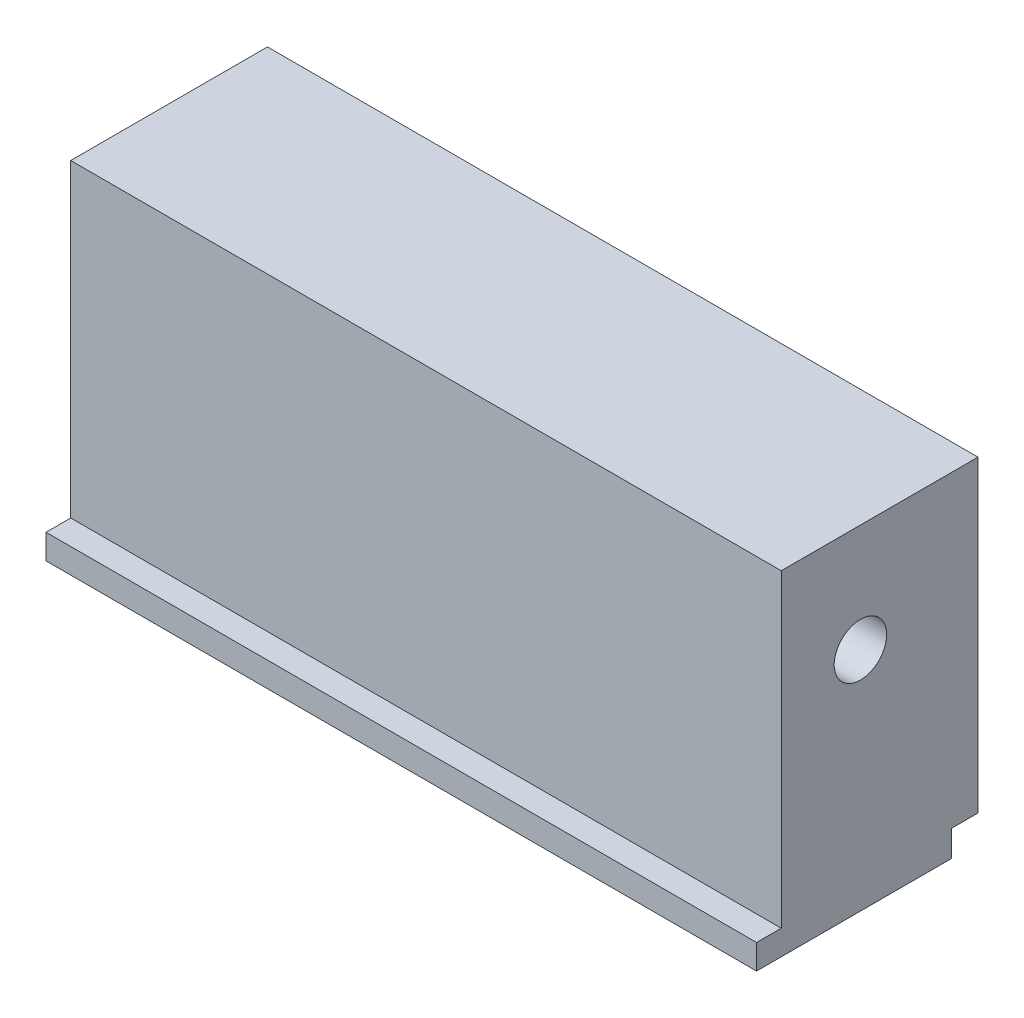
ISO-10303-21;
HEADER;
FILE_DESCRIPTION(('STEP AP214'),'2;1');
FILE_NAME('part.step','',(''),(''),'','','');
FILE_SCHEMA(('AUTOMOTIVE_DESIGN { 1 0 10303 214 1 1 1 1 }'));
ENDSEC;
DATA;
#1=APPLICATION_CONTEXT('core data for automotive mechanical design processes');
#2=APPLICATION_PROTOCOL_DEFINITION('international standard','automotive_design',2000,#1);
#3=PRODUCT_CONTEXT('',#1,'mechanical');
#4=PRODUCT('Part','Part','',(#3));
#5=PRODUCT_RELATED_PRODUCT_CATEGORY('part','',(#4));
#6=PRODUCT_DEFINITION_FORMATION('','',#4);
#7=PRODUCT_DEFINITION_CONTEXT('part definition',#1,'design');
#8=PRODUCT_DEFINITION('design','',#6,#7);
#9=PRODUCT_DEFINITION_SHAPE('','',#8);
#10=(LENGTH_UNIT() NAMED_UNIT(*) SI_UNIT(.MILLI.,.METRE.));
#11=(NAMED_UNIT(*) PLANE_ANGLE_UNIT() SI_UNIT($,.RADIAN.));
#12=(NAMED_UNIT(*) SI_UNIT($,.STERADIAN.) SOLID_ANGLE_UNIT());
#13=UNCERTAINTY_MEASURE_WITH_UNIT(LENGTH_MEASURE(1.E-05),#10,'distance_accuracy_value','');
#14=(GEOMETRIC_REPRESENTATION_CONTEXT(3) GLOBAL_UNCERTAINTY_ASSIGNED_CONTEXT((#13)) GLOBAL_UNIT_ASSIGNED_CONTEXT((#10,
#11,#12)) REPRESENTATION_CONTEXT('',''));
#15=CARTESIAN_POINT('',(0.,0.,0.));
#16=DIRECTION('',(0.,0.,1.));
#17=DIRECTION('',(1.,0.,0.));
#18=AXIS2_PLACEMENT_3D('',#15,#16,#17);
#19=CARTESIAN_POINT('',(-16.1377397473881,22.8793956546598,24.13));
#20=DIRECTION('',(1.,0.,0.));
#21=DIRECTION('',(0.,1.,0.));
#22=AXIS2_PLACEMENT_3D('',#19,#20,#21);
#23=PLANE('',#22);
#24=CARTESIAN_POINT('',(-16.1377397473881,12.3793956546598,11.43));
#25=DIRECTION('',(-1.,0.,0.));
#26=DIRECTION('',(0.,0.,1.));
#27=AXIS2_PLACEMENT_3D('',#24,#25,#26);
#28=CIRCLE('',#27,2.5527);
#29=CARTESIAN_POINT('',(-16.1377397473881,12.3793956546598,13.9827));
#30=VERTEX_POINT('',#29);
#31=EDGE_CURVE('E192',#30,#30,#28,.T.);
#32=ORIENTED_EDGE('',*,*,#31,.F.);
#33=EDGE_LOOP('',(#32));
#34=FACE_BOUND('',#33,.T.);
#35=DIRECTION('',(0.,0.,1.));
#36=VECTOR('',#35,1.);
#37=CARTESIAN_POINT('',(-16.1377397473881,-7.22381931804489,19.13));
#38=LINE('',#37,#36);
#39=CARTESIAN_POINT('',(-16.1377397473881,-7.22381931804489,19.13));
#40=VERTEX_POINT('',#39);
#41=CARTESIAN_POINT('',(-16.1377397473881,-7.22381931804489,21.53285));
#42=VERTEX_POINT('',#41);
#43=EDGE_CURVE('E68',#40,#42,#38,.T.);
#44=ORIENTED_EDGE('',*,*,#43,.F.);
#45=DIRECTION('',(0.,-1.,0.));
#46=VECTOR('',#45,1.);
#47=CARTESIAN_POINT('',(-16.1377397473881,24.0442483824095,19.13));
#48=LINE('',#47,#46);
#49=CARTESIAN_POINT('',(-16.1377397473881,22.8793956546598,19.13));
#50=VERTEX_POINT('',#49);
#51=EDGE_CURVE('E140',#50,#40,#48,.T.);
#52=ORIENTED_EDGE('',*,*,#51,.F.);
#53=DIRECTION('',(0.,0.,-1.));
#54=VECTOR('',#53,1.);
#55=CARTESIAN_POINT('',(-16.1377397473881,22.8793956546598,24.13));
#56=LINE('',#55,#54);
#57=CARTESIAN_POINT('',(-16.1377397473881,22.8793956546598,0.));
#58=VERTEX_POINT('',#57);
#59=EDGE_CURVE('E76',#50,#58,#56,.T.);
#60=ORIENTED_EDGE('',*,*,#59,.T.);
#61=DIRECTION('',(0.,-1.,0.));
#62=VECTOR('',#61,1.);
#63=CARTESIAN_POINT('',(-16.1377397473881,22.8793956546598,0.));
#64=LINE('',#63,#62);
#65=CARTESIAN_POINT('',(-16.1377397473881,-7.08960434534017,0.));
#66=VERTEX_POINT('',#65);
#67=EDGE_CURVE('E212',#58,#66,#64,.T.);
#68=ORIENTED_EDGE('',*,*,#67,.T.);
#69=DIRECTION('',(0.,0.,-1.));
#70=VECTOR('',#69,1.);
#71=CARTESIAN_POINT('',(-16.1377397473881,-7.08960434534017,24.13));
#72=LINE('',#71,#70);
#73=CARTESIAN_POINT('',(-16.1377397473881,-7.08960434534017,2.59715));
#74=VERTEX_POINT('',#73);
#75=EDGE_CURVE('E185',#74,#66,#72,.T.);
#76=ORIENTED_EDGE('',*,*,#75,.F.);
#77=DIRECTION('',(0.,-1.,0.));
#78=VECTOR('',#77,1.);
#79=CARTESIAN_POINT('',(-16.1377397473881,22.8793956546598,2.59714999999999));
#80=LINE('',#79,#78);
#81=CARTESIAN_POINT('',(-16.1377397473881,-9.63260434534019,2.59715));
#82=VERTEX_POINT('',#81);
#83=EDGE_CURVE('E208',#74,#82,#80,.T.);
#84=ORIENTED_EDGE('',*,*,#83,.T.);
#85=DIRECTION('',(0.,0.,-1.));
#86=VECTOR('',#85,1.);
#87=CARTESIAN_POINT('',(-16.1377397473881,-9.63260434534019,24.13));
#88=LINE('',#87,#86);
#89=CARTESIAN_POINT('',(-16.1377397473881,-9.63260434534019,21.53285));
#90=VERTEX_POINT('',#89);
#91=EDGE_CURVE('E231',#90,#82,#88,.T.);
#92=ORIENTED_EDGE('',*,*,#91,.F.);
#93=DIRECTION('',(0.,1.,0.));
#94=VECTOR('',#93,1.);
#95=CARTESIAN_POINT('',(-16.1377397473881,22.8793956546598,21.53285));
#96=LINE('',#95,#94);
#97=EDGE_CURVE('E200',#90,#42,#96,.T.);
#98=ORIENTED_EDGE('',*,*,#97,.T.);
#99=EDGE_LOOP('',(#44,#52,#60,#68,#76,#84,#92,#98));
#100=FACE_BOUND('',#99,.T.);
#101=ADVANCED_FACE('F47',(#34,#100),#23,.F.);
#102=CARTESIAN_POINT('',(52.9502602526119,22.8793956546598,24.13));
#103=DIRECTION('',(-1.,0.,0.));
#104=DIRECTION('',(0.,0.,1.));
#105=AXIS2_PLACEMENT_3D('',#102,#103,#104);
#106=PLANE('',#105);
#107=CARTESIAN_POINT('',(52.9502602526119,12.3793956546598,11.43));
#108=DIRECTION('',(1.,0.,0.));
#109=DIRECTION('',(0.,0.,-1.));
#110=AXIS2_PLACEMENT_3D('',#107,#108,#109);
#111=CIRCLE('',#110,2.5527);
#112=CARTESIAN_POINT('',(52.9502602526119,12.3793956546598,8.8773));
#113=VERTEX_POINT('',#112);
#114=EDGE_CURVE('E134',#113,#113,#111,.T.);
#115=ORIENTED_EDGE('',*,*,#114,.F.);
#116=EDGE_LOOP('',(#115));
#117=FACE_BOUND('',#116,.T.);
#118=DIRECTION('',(0.,0.,-1.));
#119=VECTOR('',#118,1.);
#120=CARTESIAN_POINT('',(52.9502602526119,22.8793956546598,24.13));
#121=LINE('',#120,#119);
#122=CARTESIAN_POINT('',(52.9502602526119,22.8793956546598,19.13));
#123=VERTEX_POINT('',#122);
#124=CARTESIAN_POINT('',(52.9502602526119,22.8793956546598,0.));
#125=VERTEX_POINT('',#124);
#126=EDGE_CURVE('E224',#123,#125,#121,.T.);
#127=ORIENTED_EDGE('',*,*,#126,.F.);
#128=DIRECTION('',(0.,-1.,0.));
#129=VECTOR('',#128,1.);
#130=CARTESIAN_POINT('',(52.9502602526119,22.8793956546598,19.13));
#131=LINE('',#130,#129);
#132=CARTESIAN_POINT('',(52.9502602526119,-7.22381931804489,19.13));
#133=VERTEX_POINT('',#132);
#134=EDGE_CURVE('E156',#123,#133,#131,.T.);
#135=ORIENTED_EDGE('',*,*,#134,.T.);
#136=DIRECTION('',(0.,0.,1.));
#137=VECTOR('',#136,1.);
#138=CARTESIAN_POINT('',(52.9502602526119,-7.22381931804489,24.13));
#139=LINE('',#138,#137);
#140=CARTESIAN_POINT('',(52.9502602526119,-7.22381931804489,21.53285));
#141=VERTEX_POINT('',#140);
#142=EDGE_CURVE('E152',#133,#141,#139,.T.);
#143=ORIENTED_EDGE('',*,*,#142,.T.);
#144=DIRECTION('',(0.,-1.,0.));
#145=VECTOR('',#144,1.);
#146=CARTESIAN_POINT('',(52.9502602526119,22.8793956546598,21.53285));
#147=LINE('',#146,#145);
#148=CARTESIAN_POINT('',(52.9502602526119,-9.63260434534019,21.53285));
#149=VERTEX_POINT('',#148);
#150=EDGE_CURVE('E235',#141,#149,#147,.T.);
#151=ORIENTED_EDGE('',*,*,#150,.T.);
#152=DIRECTION('',(0.,0.,-1.));
#153=VECTOR('',#152,1.);
#154=CARTESIAN_POINT('',(52.9502602526119,-9.63260434534019,24.13));
#155=LINE('',#154,#153);
#156=CARTESIAN_POINT('',(52.9502602526119,-9.63260434534019,2.59715));
#157=VERTEX_POINT('',#156);
#158=EDGE_CURVE('E227',#149,#157,#155,.T.);
#159=ORIENTED_EDGE('',*,*,#158,.T.);
#160=DIRECTION('',(0.,1.,0.));
#161=VECTOR('',#160,1.);
#162=CARTESIAN_POINT('',(52.9502602526119,22.8793956546598,2.59714999999999));
#163=LINE('',#162,#161);
#164=CARTESIAN_POINT('',(52.9502602526119,-7.08960434534017,2.59715));
#165=VERTEX_POINT('',#164);
#166=EDGE_CURVE('E238',#157,#165,#163,.T.);
#167=ORIENTED_EDGE('',*,*,#166,.T.);
#168=DIRECTION('',(0.,0.,1.));
#169=VECTOR('',#168,1.);
#170=CARTESIAN_POINT('',(52.9502602526119,-7.08960434534017,24.13));
#171=LINE('',#170,#169);
#172=CARTESIAN_POINT('',(52.9502602526119,-7.08960434534017,0.));
#173=VERTEX_POINT('',#172);
#174=EDGE_CURVE('E181',#173,#165,#171,.T.);
#175=ORIENTED_EDGE('',*,*,#174,.F.);
#176=DIRECTION('',(0.,1.,0.));
#177=VECTOR('',#176,1.);
#178=CARTESIAN_POINT('',(52.9502602526119,22.8793956546598,0.));
#179=LINE('',#178,#177);
#180=EDGE_CURVE('E215',#173,#125,#179,.T.);
#181=ORIENTED_EDGE('',*,*,#180,.T.);
#182=EDGE_LOOP('',(#127,#135,#143,#151,#159,#167,#175,#181));
#183=FACE_BOUND('',#182,.T.);
#184=ADVANCED_FACE('F289',(#117,#183),#106,.F.);
#185=CARTESIAN_POINT('',(-16.1377397473881,-9.63260434534019,0.));
#186=DIRECTION('',(0.,0.,1.));
#187=DIRECTION('',(1.,0.,0.));
#188=AXIS2_PLACEMENT_3D('',#185,#186,#187);
#189=PLANE('',#188);
#190=DIRECTION('',(1.,0.,0.));
#191=VECTOR('',#190,1.);
#192=CARTESIAN_POINT('',(-16.1377397473881,-7.08960434534017,0.));
#193=LINE('',#192,#191);
#194=EDGE_CURVE('E241',#66,#173,#193,.T.);
#195=ORIENTED_EDGE('',*,*,#194,.F.);
#196=ORIENTED_EDGE('',*,*,#67,.F.);
#197=DIRECTION('',(-1.,0.,0.));
#198=VECTOR('',#197,1.);
#199=CARTESIAN_POINT('',(-16.1377397473881,22.8793956546598,0.));
#200=LINE('',#199,#198);
#201=EDGE_CURVE('E219',#125,#58,#200,.T.);
#202=ORIENTED_EDGE('',*,*,#201,.F.);
#203=ORIENTED_EDGE('',*,*,#180,.F.);
#204=EDGE_LOOP('',(#195,#196,#202,#203));
#205=FACE_BOUND('',#204,.T.);
#206=ADVANCED_FACE('F294',(#205),#189,.F.);
#207=CARTESIAN_POINT('',(-16.1377397473881,-9.63260434534019,24.13));
#208=DIRECTION('',(0.,1.,0.));
#209=DIRECTION('',(0.,0.,1.));
#210=AXIS2_PLACEMENT_3D('',#207,#208,#209);
#211=PLANE('',#210);
#212=CARTESIAN_POINT('',(-3.18373974738812,-9.63260434534019,12.065));
#213=DIRECTION('',(0.,-1.,0.));
#214=DIRECTION('',(0.,0.,-1.));
#215=AXIS2_PLACEMENT_3D('',#212,#213,#214);
#216=CIRCLE('',#215,3.4544);
#217=CARTESIAN_POINT('',(-3.18373974738812,-9.63260434534019,8.6106));
#218=VERTEX_POINT('',#217);
#219=EDGE_CURVE('E164',#218,#218,#216,.T.);
#220=ORIENTED_EDGE('',*,*,#219,.F.);
#221=EDGE_LOOP('',(#220));
#222=FACE_BOUND('',#221,.T.);
#223=CARTESIAN_POINT('',(39.9962602526119,-9.63260434534019,12.065));
#224=DIRECTION('',(0.,-1.,0.));
#225=DIRECTION('',(0.,0.,-1.));
#226=AXIS2_PLACEMENT_3D('',#223,#224,#225);
#227=CIRCLE('',#226,3.4544);
#228=CARTESIAN_POINT('',(39.9962602526119,-9.63260434534019,8.6106));
#229=VERTEX_POINT('',#228);
#230=EDGE_CURVE('E173',#229,#229,#227,.T.);
#231=ORIENTED_EDGE('',*,*,#230,.F.);
#232=EDGE_LOOP('',(#231));
#233=FACE_BOUND('',#232,.T.);
#234=ORIENTED_EDGE('',*,*,#91,.T.);
#235=DIRECTION('',(1.,0.,0.));
#236=VECTOR('',#235,1.);
#237=CARTESIAN_POINT('',(-16.1377397473881,-9.63260434534019,2.59715));
#238=LINE('',#237,#236);
#239=EDGE_CURVE('E204',#82,#157,#238,.T.);
#240=ORIENTED_EDGE('',*,*,#239,.T.);
#241=ORIENTED_EDGE('',*,*,#158,.F.);
#242=DIRECTION('',(-1.,0.,0.));
#243=VECTOR('',#242,1.);
#244=CARTESIAN_POINT('',(-16.1377397473881,-9.63260434534019,21.53285));
#245=LINE('',#244,#243);
#246=EDGE_CURVE('E196',#149,#90,#245,.T.);
#247=ORIENTED_EDGE('',*,*,#246,.T.);
#248=EDGE_LOOP('',(#234,#240,#241,#247));
#249=FACE_BOUND('',#248,.T.);
#250=ADVANCED_FACE('F304',(#222,#233,#249),#211,.F.);
#251=CARTESIAN_POINT('',(-16.1377397473881,22.8793956546598,24.13));
#252=DIRECTION('',(0.,-1.,0.));
#253=DIRECTION('',(0.,0.,-1.));
#254=AXIS2_PLACEMENT_3D('',#251,#252,#253);
#255=PLANE('',#254);
#256=ORIENTED_EDGE('',*,*,#59,.F.);
#257=DIRECTION('',(1.,0.,0.));
#258=VECTOR('',#257,1.);
#259=CARTESIAN_POINT('',(-16.1377397473881,22.8793956546598,19.13));
#260=LINE('',#259,#258);
#261=EDGE_CURVE('E11',#50,#123,#260,.T.);
#262=ORIENTED_EDGE('',*,*,#261,.T.);
#263=ORIENTED_EDGE('',*,*,#126,.T.);
#264=ORIENTED_EDGE('',*,*,#201,.T.);
#265=EDGE_LOOP('',(#256,#262,#263,#264));
#266=FACE_BOUND('',#265,.T.);
#267=ADVANCED_FACE('F312',(#266),#255,.F.);
#268=CARTESIAN_POINT('',(67.1742602526119,-7.21960434534019,2.59715));
#269=DIRECTION('',(0.,0.,1.));
#270=DIRECTION('',(0.,-1.,0.));
#271=AXIS2_PLACEMENT_3D('',#268,#269,#270);
#272=PLANE('',#271);
#273=ORIENTED_EDGE('',*,*,#83,.F.);
#274=DIRECTION('',(1.,0.,0.));
#275=VECTOR('',#274,1.);
#276=CARTESIAN_POINT('',(-41.5377397473881,-7.08960434534017,2.59715));
#277=LINE('',#276,#275);
#278=EDGE_CURVE('E177',#74,#165,#277,.T.);
#279=ORIENTED_EDGE('',*,*,#278,.T.);
#280=ORIENTED_EDGE('',*,*,#166,.F.);
#281=ORIENTED_EDGE('',*,*,#239,.F.);
#282=EDGE_LOOP('',(#273,#279,#280,#281));
#283=FACE_BOUND('',#282,.T.);
#284=ADVANCED_FACE('F321',(#283),#272,.F.);
#285=CARTESIAN_POINT('',(67.1742602526119,-10.3700800571753,21.53285));
#286=DIRECTION('',(0.,0.,-1.));
#287=DIRECTION('',(-1.,0.,0.));
#288=AXIS2_PLACEMENT_3D('',#285,#286,#287);
#289=PLANE('',#288);
#290=ORIENTED_EDGE('',*,*,#150,.F.);
#291=DIRECTION('',(-1.,0.,0.));
#292=VECTOR('',#291,1.);
#293=CARTESIAN_POINT('',(67.1742602526119,-7.22381931804489,21.53285));
#294=LINE('',#293,#292);
#295=EDGE_CURVE('E61',#141,#42,#294,.T.);
#296=ORIENTED_EDGE('',*,*,#295,.T.);
#297=ORIENTED_EDGE('',*,*,#97,.F.);
#298=ORIENTED_EDGE('',*,*,#246,.F.);
#299=EDGE_LOOP('',(#290,#296,#297,#298));
#300=FACE_BOUND('',#299,.T.);
#301=ADVANCED_FACE('F285',(#300),#289,.F.);
#302=CARTESIAN_POINT('',(-16.1377397473881,12.3793956546598,11.43));
#303=DIRECTION('',(-1.,0.,0.));
#304=DIRECTION('',(0.,0.,1.));
#305=AXIS2_PLACEMENT_3D('',#302,#303,#304);
#306=CYLINDRICAL_SURFACE('',#305,2.5527);
#307=CARTESIAN_POINT('',(-5.33379470105452,9.94888675724317,10.6496771247874));
#308=CARTESIAN_POINT('',(-5.27285452011806,9.96396065776999,10.602728765378));
#309=CARTESIAN_POINT('',(-5.20952725506987,9.97946930463055,10.5590620649738));
#310=CARTESIAN_POINT('',(-5.07920910806528,10.0106243760823,10.4775805669928));
#311=CARTESIAN_POINT('',(-5.01221538824365,10.0262708993023,10.4397703916458));
#312=CARTESIAN_POINT('',(-4.87519641125399,10.0571402634383,10.3693932790166));
#313=CARTESIAN_POINT('',(-4.80516289931581,10.0723617388828,10.3368419203703));
#314=CARTESIAN_POINT('',(-4.66279275637979,10.1018315884118,10.2767007566262));
#315=CARTESIAN_POINT('',(-4.59045557244914,10.1160797262528,10.2491121534275));
#316=CARTESIAN_POINT('',(-4.42116160546763,10.1473554517449,10.1907714426447));
#317=CARTESIAN_POINT('',(-4.32353015288059,10.1638736866961,10.1616939107369));
#318=CARTESIAN_POINT('',(-4.12580334721681,10.1935807663791,10.1111564920226));
#319=CARTESIAN_POINT('',(-4.0257073346674,10.2067687091203,10.0896986683324));
#320=CARTESIAN_POINT('',(-3.82393420332003,10.229046489226,10.054240448388));
#321=CARTESIAN_POINT('',(-3.72226018435047,10.2381435131213,10.0402269667171));
#322=CARTESIAN_POINT('',(-3.51787624987886,10.2517233920533,10.0195241884918));
#323=CARTESIAN_POINT('',(-3.41516648735735,10.256206918714,10.012833825843));
#324=CARTESIAN_POINT('',(-3.20951963584029,10.2602761050919,10.006756068174));
#325=CARTESIAN_POINT('',(-3.1065828105585,10.2598658793694,10.00736253814));
#326=CARTESIAN_POINT('',(-2.90113637701932,10.2541835444001,10.0158654428175));
#327=CARTESIAN_POINT('',(-2.79862681245944,10.2489109495506,10.0237626056475));
#328=CARTESIAN_POINT('',(-2.59461427234603,10.2338234761372,10.0468921871241));
#329=CARTESIAN_POINT('',(-2.49311315917578,10.2240013793262,10.0621362639588));
#330=CARTESIAN_POINT('',(-2.29198959877277,10.2003996063113,10.1000554252311));
#331=CARTESIAN_POINT('',(-2.19236684734483,10.1866205768905,10.1227292953122));
#332=CARTESIAN_POINT('',(-2.01239525115007,10.1584886820904,10.1712332712004));
#333=CARTESIAN_POINT('',(-1.9316461455555,10.1446305753784,10.1958736237474));
#334=CARTESIAN_POINT('',(-1.77236124931081,10.1152324229202,10.2506738258414));
#335=CARTESIAN_POINT('',(-1.69382509710422,10.0996926539591,10.2808327676459));
#336=CARTESIAN_POINT('',(-1.53968651161827,10.0675415749761,10.3469681509731));
#337=CARTESIAN_POINT('',(-1.46407744644726,10.0509329456023,10.3829303556648));
#338=CARTESIAN_POINT('',(-1.31638409596564,10.017277629694,10.4612418881081));
#339=CARTESIAN_POINT('',(-1.24429736385845,10.0002312601645,10.5035866961818));
#340=CARTESIAN_POINT('',(-1.10215525023242,9.96587287058051,10.597077551688));
#341=CARTESIAN_POINT('',(-1.03226760590411,9.94857353709475,10.648486505447));
#342=CARTESIAN_POINT('',(-0.899301193692127,9.91550758695134,10.7599896842142));
#343=CARTESIAN_POINT('',(-0.836217606457724,9.8997398862272,10.8200776902927));
#344=CARTESIAN_POINT('',(-0.731528802367575,9.87419581690476,10.9369711434088));
#345=CARTESIAN_POINT('',(-0.688148796215743,9.86385168775467,10.9920432967604));
#346=CARTESIAN_POINT('',(-0.610116656351126,9.84633534701834,11.1085463380688));
#347=CARTESIAN_POINT('',(-0.575448480176422,9.83915728655972,11.1699652398959));
#348=CARTESIAN_POINT('',(-0.524338014016374,9.8304061360778,11.2837259232016));
#349=CARTESIAN_POINT('',(-0.505540662094689,9.82792655452573,11.3349306020072));
#350=CARTESIAN_POINT('',(-0.476177103842152,9.82617848466938,11.4397039237887));
#351=CARTESIAN_POINT('',(-0.465602911417495,9.82690687628101,11.4932702196581));
#352=CARTESIAN_POINT('',(-0.453472301930097,9.83188323338288,11.6014571549296));
#353=CARTESIAN_POINT('',(-0.451947186278946,9.83614335756383,11.656080799079));
#354=CARTESIAN_POINT('',(-0.457944608347973,9.8481119677774,11.7644490495663));
#355=CARTESIAN_POINT('',(-0.465471666851652,9.85582217562258,11.8181932030827));
#356=CARTESIAN_POINT('',(-0.488199992494542,9.87387534013737,11.9211979363765));
#357=CARTESIAN_POINT('',(-0.503082178849013,9.88410062337235,11.9705518699916));
#358=CARTESIAN_POINT('',(-0.539162795557112,9.9067834768143,12.0663113864983));
#359=CARTESIAN_POINT('',(-0.560363386917727,9.91924181018218,12.1127159540554));
#360=CARTESIAN_POINT('',(-0.623940618583785,9.95486060599649,12.2325185187189));
#361=CARTESIAN_POINT('',(-0.67095093851204,9.97956815658997,12.3029909639794));
#362=CARTESIAN_POINT('',(-0.774864464079302,10.0318094659544,12.4350858808913));
#363=CARTESIAN_POINT('',(-0.831800117338286,10.0593523691325,12.4966780757606));
#364=CARTESIAN_POINT('',(-0.943244679795029,10.1115015201443,12.6029738249041));
#365=CARTESIAN_POINT('',(-0.99677839813124,10.1359073106587,12.648817698543));
#366=CARTESIAN_POINT('',(-1.10767281703469,10.185147677951,12.7353862376416));
#367=CARTESIAN_POINT('',(-1.16503627052262,10.2099825534523,12.7761071585922));
#368=CARTESIAN_POINT('',(-1.34182975889496,10.2844560376561,12.8914771824688));
#369=CARTESIAN_POINT('',(-1.4658527334829,10.3340114833964,12.9592341753682));
#370=CARTESIAN_POINT('',(-1.66364940269024,10.4073813191272,13.0514603285028));
#371=CARTESIAN_POINT('',(-1.73442864834815,10.4325923154278,13.0815443935967));
#372=CARTESIAN_POINT('',(-1.87834097249613,10.4812679195838,13.1372670326508));
#373=CARTESIAN_POINT('',(-1.95147436676438,10.5047322917424,13.1629050072555));
#374=CARTESIAN_POINT('',(-2.09977078989927,10.5491601098972,13.2097625331561));
#375=CARTESIAN_POINT('',(-2.17493106764195,10.5701267553531,13.230987763512));
#376=CARTESIAN_POINT('',(-2.32720350097651,10.6087686848207,13.2689922814415));
#377=CARTESIAN_POINT('',(-2.40431540956554,10.6264443829994,13.2857721285808));
#378=CARTESIAN_POINT('',(-2.55371508072866,10.6562861693314,13.3134943526541));
#379=CARTESIAN_POINT('',(-2.62586569931611,10.6687898028304,13.3248080344015));
#380=CARTESIAN_POINT('',(-2.77128566920835,10.6895725761574,13.3433663647996));
#381=CARTESIAN_POINT('',(-2.84455472445131,10.6978528146536,13.3506120717373));
#382=CARTESIAN_POINT('',(-2.99161111213784,10.7096278025619,13.3608585304364));
#383=CARTESIAN_POINT('',(-3.06539687118559,10.7131334801668,13.3638689765435));
#384=CARTESIAN_POINT('',(-3.21308677269231,10.7151349611629,13.3655917874675));
#385=CARTESIAN_POINT('',(-3.286990913754,10.713630823256,13.364304202646));
#386=CARTESIAN_POINT('',(-3.43414969627642,10.7057357402555,13.3574766728573));
#387=CARTESIAN_POINT('',(-3.50740550251254,10.6993570728945,13.3519474114886));
#388=CARTESIAN_POINT('',(-3.65294922928944,10.6821750290253,13.3367899009612));
#389=CARTESIAN_POINT('',(-3.72523705995306,10.6713712445437,13.3271612738586));
#390=CARTESIAN_POINT('',(-3.94077119853811,10.6331693042059,13.2923028422386));
#391=CARTESIAN_POINT('',(-4.0820890588853,10.6000217420721,13.2611306340857));
#392=CARTESIAN_POINT('',(-4.31304002629857,10.5363731181807,13.1966000315398));
#393=CARTESIAN_POINT('',(-4.40459672190086,10.5084882834935,13.1672151562529));
#394=CARTESIAN_POINT('',(-4.58435025899017,10.4496983123775,13.1016721975258));
#395=CARTESIAN_POINT('',(-4.67254507198989,10.4187913913585,13.0655101003337));
#396=CARTESIAN_POINT('',(-4.84469768656269,10.3552927871542,12.9862320963626));
#397=CARTESIAN_POINT('',(-4.92866951878184,10.3227075275606,12.9431415326576));
#398=CARTESIAN_POINT('',(-5.09183123760373,10.2568372372737,12.8492648976933));
#399=CARTESIAN_POINT('',(-5.17102609189511,10.2235529838112,12.7984870205489));
#400=CARTESIAN_POINT('',(-5.31450203725216,10.1611662652474,12.6945069474644));
#401=CARTESIAN_POINT('',(-5.3794501683297,10.1320238034842,12.6422580245239));
#402=CARTESIAN_POINT('',(-5.50295338687954,10.0749112584455,12.5298219637816));
#403=CARTESIAN_POINT('',(-5.56150038045601,10.0469426863891,12.4696249835283));
#404=CARTESIAN_POINT('',(-5.67023341838794,9.99308297759595,12.3393135935722));
#405=CARTESIAN_POINT('',(-5.72027489404814,9.96723102339862,12.269059208409));
#406=CARTESIAN_POINT('',(-5.80613987733377,9.92019039177985,12.1189673960866));
#407=CARTESIAN_POINT('',(-5.84203141307734,9.8989796258614,12.0391782846996));
#408=CARTESIAN_POINT('',(-5.88348026264327,9.87081981619869,11.905359331647));
#409=CARTESIAN_POINT('',(-5.89542862570879,9.86155981647564,11.8537921853975));
#410=CARTESIAN_POINT('',(-5.91103011948329,9.84614958726343,11.7489599709128));
#411=CARTESIAN_POINT('',(-5.91469074414938,9.8399965523032,11.6956964807866));
#412=CARTESIAN_POINT('',(-5.91317109896106,9.83108005136534,11.5888836069049));
#413=CARTESIAN_POINT('',(-5.90797074858084,9.82832430864979,11.5353338486681));
#414=CARTESIAN_POINT('',(-5.88901280123046,9.8261475069646,11.4296979528418));
#415=CARTESIAN_POINT('',(-5.87524882907938,9.82672893500362,11.3776129358982));
#416=CARTESIAN_POINT('',(-5.8365270318479,9.83125436217886,11.2656411085264));
#417=CARTESIAN_POINT('',(-5.80983559303124,9.83587306468988,11.2063869027985));
#418=CARTESIAN_POINT('',(-5.74776902337112,9.84838950821019,11.0930175914289));
#419=CARTESIAN_POINT('',(-5.71237918970525,9.85629281695281,11.0389114044932));
#420=CARTESIAN_POINT('',(-5.62534099382003,9.876665926834,10.9231516377962));
#421=CARTESIAN_POINT('',(-5.57184204754793,9.88978427928684,10.863021579576));
#422=CARTESIAN_POINT('',(-5.45768793162201,9.9180734190666,10.7506375554798));
#423=CARTESIAN_POINT('',(-5.39702630299185,9.93324606069276,10.6983907965909));
#424=CARTESIAN_POINT('',(-5.33379470105452,9.94888675724317,10.6496771247874));
#425=B_SPLINE_CURVE_WITH_KNOTS('',3,(#307,#308,#309,#310,#311,#312,#313,#314,#315,#316,#317,
#318,#319,#320,#321,#322,#323,#324,#325,#326,#327,#328,#329,#330,#331,#332,#333,#334,#335,#336,
#337,#338,#339,#340,#341,#342,#343,#344,#345,#346,#347,#348,#349,#350,#351,#352,#353,#354,#355,
#356,#357,#358,#359,#360,#361,#362,#363,#364,#365,#366,#367,#368,#369,#370,#371,#372,#373,#374,
#375,#376,#377,#378,#379,#380,#381,#382,#383,#384,#385,#386,#387,#388,#389,#390,#391,#392,#393,
#394,#395,#396,#397,#398,#399,#400,#401,#402,#403,#404,#405,#406,#407,#408,#409,#410,#411,#412,
#413,#414,#415,#416,#417,#418,#419,#420,#421,#422,#423,#424),.UNSPECIFIED.,.T.,.F.,(4,2,2,2,2,2,
2,2,2,2,2,2,2,2,2,2,2,2,2,2,2,2,2,2,2,2,2,2,2,2,2,2,2,2,2,2,2,2,2,2,2,2,2,2,2,2,2,2,2,2,2,2,2,2,
2,2,2,2,4),(0.,0.235059684379752,0.470303953252492,0.70623281019766,0.942218728596528,
1.25142790492367,1.56072073917215,1.86946809461821,2.17817049686314,2.48661336717184,
2.79508704487498,3.10405183275892,3.41296614731461,3.66942423600081,3.92584017823231,
4.18163637392562,4.43725227772489,4.70211220041768,4.96678327204287,5.17869537785415,
5.39021434885725,5.55335220346439,5.7163314247749,5.87987407585931,6.04349843638012,
6.2005764554759,6.3577082598239,6.62091740981553,6.88500374974776,7.10844486048998,
7.33204835324656,7.77972215249648,8.02241037257333,8.26513128287022,8.50753785858238,
8.7499139066871,8.97198202410223,9.19399234351494,9.41549365860851,9.63699237829567,
9.85793502892044,10.0788980539171,10.5226081493827,10.8226977386242,11.1229656182365,
11.4221591646399,11.7210360092729,11.985479781747,12.2502541537082,12.5191561439814,
12.7867491016658,12.9473038537448,13.1077133705704,13.2684868871941,13.4293802349707,
13.6237622646053,13.8184751437298,14.0621519038528,14.3060501031331),.UNSPECIFIED.);
#426=CARTESIAN_POINT('',(-5.33379470105452,9.94888675724317,10.6496771247874));
#427=VERTEX_POINT('',#426);
#428=EDGE_CURVE('E168',#427,#427,#425,.T.);
#429=ORIENTED_EDGE('',*,*,#428,.T.);
#430=EDGE_LOOP('',(#429));
#431=FACE_BOUND('',#430,.T.);
#432=CARTESIAN_POINT('',(0.372260252611875,12.3793956546598,11.43));
#433=DIRECTION('',(-1.,0.,0.));
#434=DIRECTION('',(0.,0.,1.));
#435=AXIS2_PLACEMENT_3D('',#432,#433,#434);
#436=CIRCLE('',#435,2.5527);
#437=CARTESIAN_POINT('',(0.372260252611875,12.3793956546598,13.9827));
#438=VERTEX_POINT('',#437);
#439=EDGE_CURVE('E188',#438,#438,#436,.T.);
#440=ORIENTED_EDGE('',*,*,#439,.F.);
#441=EDGE_LOOP('',(#440));
#442=FACE_BOUND('',#441,.T.);
#443=ORIENTED_EDGE('',*,*,#31,.T.);
#444=EDGE_LOOP('',(#443));
#445=FACE_BOUND('',#444,.T.);
#446=ADVANCED_FACE('F252',(#431,#442,#445),#306,.F.);
#447=CARTESIAN_POINT('',(0.372260252611875,12.3793956546598,11.43));
#448=DIRECTION('',(-1.,0.,0.));
#449=DIRECTION('',(0.,0.,1.));
#450=AXIS2_PLACEMENT_3D('',#447,#448,#449);
#451=CONICAL_SURFACE('',#450,2.5527,1.02974425867665);
#452=CARTESIAN_POINT('',(1.90607715480354,12.3793956546598,11.43));
#453=VERTEX_POINT('',#452);
#454=VERTEX_LOOP('',#453);
#455=FACE_BOUND('',#454,.T.);
#456=ORIENTED_EDGE('',*,*,#439,.T.);
#457=EDGE_LOOP('',(#456));
#458=FACE_BOUND('',#457,.T.);
#459=ADVANCED_FACE('F278',(#455,#458),#451,.F.);
#460=CARTESIAN_POINT('',(-41.5377397473881,-7.08960434534017,-4.95940193624807));
#461=DIRECTION('',(0.,-1.,0.));
#462=DIRECTION('',(1.,0.,0.));
#463=AXIS2_PLACEMENT_3D('',#460,#461,#462);
#464=PLANE('',#463);
#465=ORIENTED_EDGE('',*,*,#75,.T.);
#466=ORIENTED_EDGE('',*,*,#194,.T.);
#467=ORIENTED_EDGE('',*,*,#174,.T.);
#468=ORIENTED_EDGE('',*,*,#278,.F.);
#469=EDGE_LOOP('',(#465,#466,#467,#468));
#470=FACE_BOUND('',#469,.T.);
#471=ADVANCED_FACE('F275',(#470),#464,.T.);
#472=CARTESIAN_POINT('',(39.9962602526119,-9.63260434534019,12.065));
#473=DIRECTION('',(0.,-1.,0.));
#474=DIRECTION('',(0.,0.,-1.));
#475=AXIS2_PLACEMENT_3D('',#472,#473,#474);
#476=CYLINDRICAL_SURFACE('',#475,3.4544);
#477=CARTESIAN_POINT('',(39.9962602526119,9.41993565465982,12.065));
#478=DIRECTION('',(0.,-1.,0.));
#479=DIRECTION('',(0.,0.,-1.));
#480=AXIS2_PLACEMENT_3D('',#477,#478,#479);
#481=CIRCLE('',#480,3.4544);
#482=CARTESIAN_POINT('',(39.9962602526119,9.41993565465982,8.6106));
#483=VERTEX_POINT('',#482);
#484=EDGE_CURVE('E169',#483,#483,#481,.T.);
#485=ORIENTED_EDGE('',*,*,#484,.F.);
#486=EDGE_LOOP('',(#485));
#487=FACE_BOUND('',#486,.T.);
#488=ORIENTED_EDGE('',*,*,#230,.T.);
#489=EDGE_LOOP('',(#488));
#490=FACE_BOUND('',#489,.T.);
#491=ADVANCED_FACE('F271',(#487,#490),#476,.F.);
#492=CARTESIAN_POINT('',(39.9962602526119,9.41993565465982,12.065));
#493=DIRECTION('',(0.,-1.,0.));
#494=DIRECTION('',(0.,0.,-1.));
#495=AXIS2_PLACEMENT_3D('',#492,#493,#494);
#496=CONICAL_SURFACE('',#495,3.4544,1.02974425867665);
#497=CARTESIAN_POINT('',(37.8462052989455,9.94888675724317,10.6496771247874));
#498=CARTESIAN_POINT('',(37.7762421413005,9.9315803154556,10.7035727884169));
#499=CARTESIAN_POINT('',(37.7094083827122,9.91484219257737,10.7618022482806));
#500=CARTESIAN_POINT('',(37.5848420986555,9.8840506693202,10.8880256208434));
#501=CARTESIAN_POINT('',(37.5270956378493,9.86999315109253,10.9560042710498));
#502=CARTESIAN_POINT('',(37.441795948264,9.85054015873848,11.0783692936504));
#503=CARTESIAN_POINT('',(37.4105417626753,9.8438151753108,11.1299418283223));
#504=CARTESIAN_POINT('',(37.3559916691201,9.83339777738862,11.2374421091476));
#505=CARTESIAN_POINT('',(37.3326864355738,9.82970180211754,11.2933646566455));
#506=CARTESIAN_POINT('',(37.295692926631,9.82611913142858,11.4091468040931));
#507=CARTESIAN_POINT('',(37.2821074180765,9.82627254067339,11.4690413638703));
#508=CARTESIAN_POINT('',(37.266318959881,9.83100563436672,11.59013927318));
#509=CARTESIAN_POINT('',(37.2641075888445,9.83558204105091,11.6513416207037));
#510=CARTESIAN_POINT('',(37.270533502834,9.84810849345093,11.76411224925));
#511=CARTESIAN_POINT('',(37.2777042918187,9.85550061106953,11.8158362662618));
#512=CARTESIAN_POINT('',(37.2996129512337,9.87308118563146,11.9171479397239));
#513=CARTESIAN_POINT('',(37.3143552986169,9.8832712953262,11.9667343133931));
#514=CARTESIAN_POINT('',(37.3574127825656,9.91044477257569,12.0821840666797));
#515=CARTESIAN_POINT('',(37.3887971542394,9.92851586157758,12.1466388660787));
#516=CARTESIAN_POINT('',(37.4608709174278,9.96767858333086,12.2690799361481));
#517=CARTESIAN_POINT('',(37.5015815144655,9.98877705811726,12.3270510103896));
#518=CARTESIAN_POINT('',(37.6164442555372,10.04621429119,12.4699887304975));
#519=CARTESIAN_POINT('',(37.6959165209601,10.0840437526176,12.5500390768761));
#520=CARTESIAN_POINT('',(37.865776541977,10.1615087694917,12.6965452691181));
#521=CARTESIAN_POINT('',(37.9561974373965,10.2011495701687,12.7629581141409));
#522=CARTESIAN_POINT('',(38.1278974953635,10.2731528454013,12.8734489163064));
#523=CARTESIAN_POINT('',(38.2079709365237,10.3055643299387,12.9193999529533));
#524=CARTESIAN_POINT('',(38.3722639026242,10.3692235531744,13.004262103017));
#525=CARTESIAN_POINT('',(38.4564863003775,10.4004704584341,13.0431682487287));
#526=CARTESIAN_POINT('',(38.6284912666246,10.4607543802581,13.1144194702558));
#527=CARTESIAN_POINT('',(38.7162758234733,10.4897901358341,13.1467608195088));
#528=CARTESIAN_POINT('',(38.8949216300324,10.5444030952892,13.2050121300965));
#529=CARTESIAN_POINT('',(38.985781459193,10.5699818694955,13.2309250160487));
#530=CARTESIAN_POINT('',(39.2225099531668,10.62928207053,13.2890239059952));
#531=CARTESIAN_POINT('',(39.3705442686496,10.6594781343695,13.3165258788034));
#532=CARTESIAN_POINT('',(39.5957364674294,10.6910668416409,13.3446828979527));
#533=CARTESIAN_POINT('',(39.6711779811057,10.6993094461493,13.351884581469));
#534=CARTESIAN_POINT('',(39.8227546121456,10.7107135357488,13.3617967572415));
#535=CARTESIAN_POINT('',(39.8988896626645,10.7138755054199,13.3645076778178));
#536=CARTESIAN_POINT('',(40.0514667255629,10.7148607283501,13.3653556732986));
#537=CARTESIAN_POINT('',(40.1279089359175,10.7126667277292,13.3634779662428));
#538=CARTESIAN_POINT('',(40.2802022898455,10.7030909988999,13.3551792664654));
#539=CARTESIAN_POINT('',(40.3560533816754,10.6957088215899,13.3487578804311));
#540=CARTESIAN_POINT('',(40.5826212509584,10.6664668505527,13.322843978538));
#541=CARTESIAN_POINT('',(40.7317275268655,10.6375144129014,13.2967002940981));
#542=CARTESIAN_POINT('',(40.9726363921937,10.5791669283222,13.2401018824653));
#543=CARTESIAN_POINT('',(41.0665115477817,10.5533481235476,13.2142215592352));
#544=CARTESIAN_POINT('',(41.251047140035,10.4979029968277,13.1556580581274));
#545=CARTESIAN_POINT('',(41.3417057885884,10.4682745981047,13.1229711636211));
#546=CARTESIAN_POINT('',(41.5191691502733,10.4066246255525,13.0507112936229));
#547=CARTESIAN_POINT('',(41.6059806271533,10.3746075408657,13.0111510582748));
#548=CARTESIAN_POINT('',(41.775255757784,10.3092935192814,12.9246217897188));
#549=CARTESIAN_POINT('',(41.8577230380841,10.2759976913643,12.8776590712178));
#550=CARTESIAN_POINT('',(42.0172818373589,10.2091805852091,12.7754289697801));
#551=CARTESIAN_POINT('',(42.0943739959272,10.1756593343167,12.7201625773871));
#552=CARTESIAN_POINT('',(42.2412483766723,10.1096163761795,12.6000746758637));
#553=CARTESIAN_POINT('',(42.3110383197026,10.0770936394269,12.5352634370384));
#554=CARTESIAN_POINT('',(42.4264226117841,10.0212604482706,12.4093701658712));
#555=CARTESIAN_POINT('',(42.4740192171037,9.99745060652908,12.3503681324601));
#556=CARTESIAN_POINT('',(42.5598633114265,9.95269946952401,12.2248807530453));
#557=CARTESIAN_POINT('',(42.5981287557049,9.93175269976214,12.158410144308));
#558=CARTESIAN_POINT('',(42.6526647468585,9.89962558292129,12.0380513991817));
#559=CARTESIAN_POINT('',(42.6720948171579,9.88735679436383,11.9859000262417));
#560=CARTESIAN_POINT('',(42.7026654753694,9.86583272186655,11.8786196965951));
#561=CARTESIAN_POINT('',(42.7138155475456,9.85657399692971,11.8234942244603));
#562=CARTESIAN_POINT('',(42.7266229344093,9.84160210696868,11.7112523752612));
#563=CARTESIAN_POINT('',(42.7282155303188,9.83591334757388,11.6541250538473));
#564=CARTESIAN_POINT('',(42.721308196606,9.82843783093239,11.5402234389547));
#565=CARTESIAN_POINT('',(42.7128076952457,9.82665129474894,11.4834491656581));
#566=CARTESIAN_POINT('',(42.6876418128833,9.82673772124857,11.3772940884436));
#567=CARTESIAN_POINT('',(42.6717961148823,9.82829030757377,11.3277125518793));
#568=CARTESIAN_POINT('',(42.6334460793585,9.83397623629597,11.2313813525925));
#569=CARTESIAN_POINT('',(42.6109388196496,9.83811071215976,11.1846329435256));
#570=CARTESIAN_POINT('',(42.5468684127701,9.85121717196328,11.0701813784204));
#571=CARTESIAN_POINT('',(42.5015683394072,9.86159507737627,11.0047387408651));
#572=CARTESIAN_POINT('',(42.4018098614967,9.88544833343279,10.881869105785));
#573=CARTESIAN_POINT('',(42.3473260836678,9.89893230460914,10.8244651452449));
#574=CARTESIAN_POINT('',(42.2426664866425,9.92495420492748,10.7271260324754));
#575=CARTESIAN_POINT('',(42.1935720672986,9.93720217781432,10.6859270847107));
#576=CARTESIAN_POINT('',(42.0920536377082,9.96230361454342,10.6080418099249));
#577=CARTESIAN_POINT('',(42.0396275427541,9.97515745616665,10.5713583513578));
#578=CARTESIAN_POINT('',(41.8782481669505,10.0139949640976,10.4673610397425));
#579=CARTESIAN_POINT('',(41.7653371493835,10.0402173086638,10.4062269423555));
#580=CARTESIAN_POINT('',(41.5604520554724,10.0845540946709,10.3110671631143));
#581=CARTESIAN_POINT('',(41.4699036571569,10.1031111519441,10.274053351924));
#582=CARTESIAN_POINT('',(41.2856198081749,10.1381132311453,10.2075652158578));
#583=CARTESIAN_POINT('',(41.1918828945096,10.1545572665539,10.1780944063064));
#584=CARTESIAN_POINT('',(41.0020841471365,10.1844830323802,10.1263410435162));
#585=CARTESIAN_POINT('',(40.9060243596761,10.1979672716409,10.1040523948271));
#586=CARTESIAN_POINT('',(40.7121193114053,10.221294693311,10.0664134020934));
#587=CARTESIAN_POINT('',(40.6142740855313,10.2311379468852,10.0510629224378));
#588=CARTESIAN_POINT('',(40.4161828378319,10.2467354959306,10.0270579578335));
#589=CARTESIAN_POINT('',(40.3159220986215,10.2524367949119,10.0184901372205));
#590=CARTESIAN_POINT('',(40.1148860363135,10.2592045883528,10.00834437731));
#591=CARTESIAN_POINT('',(40.0141106917871,10.2602708882043,10.0067667315063));
#592=CARTESIAN_POINT('',(39.8126071591427,10.2577004438109,10.010601551262));
#593=CARTESIAN_POINT('',(39.7118792521141,10.2540568663731,10.0160241729474));
#594=CARTESIAN_POINT('',(39.5113199075646,10.2422783071483,10.0338909791838));
#595=CARTESIAN_POINT('',(39.4114884336269,10.2341435086593,10.0463348771793));
#596=CARTESIAN_POINT('',(39.2117274285951,10.2136889829593,10.0785703671347));
#597=CARTESIAN_POINT('',(39.1118240556975,10.201301692101,10.0984810959956));
#598=CARTESIAN_POINT('',(38.9143041624441,10.1730774690666,10.1457896987479));
#599=CARTESIAN_POINT('',(38.8166875549487,10.1572406685749,10.1731872868396));
#600=CARTESIAN_POINT('',(38.624779252276,10.1230202985916,10.2357159905683));
#601=CARTESIAN_POINT('',(38.5304777267627,10.1046452280307,10.2708215196702));
#602=CARTESIAN_POINT('',(38.3458265798585,10.06628415811,10.3493945316512));
#603=CARTESIAN_POINT('',(38.2554731367863,10.0462997723322,10.392853697935));
#604=CARTESIAN_POINT('',(38.1116928748576,10.0131656625401,10.4716998375816));
#605=CARTESIAN_POINT('',(38.0567184896015,10.0001551548726,10.5043306519879));
#606=CARTESIAN_POINT('',(37.9493474120295,9.97429224341913,10.5737707799759));
#607=CARTESIAN_POINT('',(37.8969531147429,9.96143999453991,10.6105838748223));
#608=CARTESIAN_POINT('',(37.8462052989455,9.94888675724317,10.6496771247874));
#609=B_SPLINE_CURVE_WITH_KNOTS('',3,(#497,#498,#499,#500,#501,#502,#503,#504,#505,#506,#507,
#508,#509,#510,#511,#512,#513,#514,#515,#516,#517,#518,#519,#520,#521,#522,#523,#524,#525,#526,
#527,#528,#529,#530,#531,#532,#533,#534,#535,#536,#537,#538,#539,#540,#541,#542,#543,#544,#545,
#546,#547,#548,#549,#550,#551,#552,#553,#554,#555,#556,#557,#558,#559,#560,#561,#562,#563,#564,
#565,#566,#567,#568,#569,#570,#571,#572,#573,#574,#575,#576,#577,#578,#579,#580,#581,#582,#583,
#584,#585,#586,#587,#588,#589,#590,#591,#592,#593,#594,#595,#596,#597,#598,#599,#600,#601,#602,
#603,#604,#605,#606,#607,#608),.UNSPECIFIED.,.T.,.F.,(4,2,2,2,2,2,2,2,2,2,2,2,2,2,2,2,2,2,2,2,2,
2,2,2,2,2,2,2,2,2,2,2,2,2,2,2,2,2,2,2,2,2,2,2,2,2,2,2,2,2,2,2,2,2,2,4),(0.,0.269856813731683,
0.539295683313205,0.720718690277139,0.90192811669991,1.08502624290543,1.26798878397962,
1.42549702722357,1.58309851021727,1.8036431899488,2.02469440021153,2.37963389898915,
2.73567594204851,3.02883870631054,3.32220739603216,3.61574215610241,3.90914312716225,
4.36775721629743,4.59619954768423,4.82462008944136,5.05377744230243,5.28295463404677,
5.74315872703799,6.04510078473128,6.34720814783375,6.64876139743165,6.95005878473039,
7.25132025881313,7.55225991082068,7.7899387751905,8.02715661714641,8.19748843890194,
8.36762485307629,8.53891206345699,8.71020897710721,8.86580705839524,9.0214734963489,
9.26090505588099,9.50100931226577,9.69648790128435,9.8920900337111,10.2838726891674,
10.5822567792869,10.8807796755277,11.1790485460548,11.4773115864703,11.7793267511163,
12.0813545962423,12.3838211221619,12.6862753045763,12.9937761476885,13.3012652540567,
13.6077486790697,13.9139285454011,14.1094910974479,14.3052318892579),.UNSPECIFIED.);
#610=CARTESIAN_POINT('',(37.8462052989455,9.94888675724317,10.6496771247874));
#611=VERTEX_POINT('',#610);
#612=EDGE_CURVE('E50',#611,#611,#609,.T.);
#613=ORIENTED_EDGE('',*,*,#612,.T.);
#614=EDGE_LOOP('',(#613));
#615=FACE_BOUND('',#614,.T.);
#616=ORIENTED_EDGE('',*,*,#484,.T.);
#617=EDGE_LOOP('',(#616));
#618=FACE_BOUND('',#617,.T.);
#619=ADVANCED_FACE('F262',(#615,#618),#496,.F.);
#620=CARTESIAN_POINT('',(-3.18373974738812,9.41993565465982,12.065));
#621=DIRECTION('',(0.,-1.,0.));
#622=DIRECTION('',(0.,0.,-1.));
#623=AXIS2_PLACEMENT_3D('',#620,#621,#622);
#624=CONICAL_SURFACE('',#623,3.45439999999999,1.02974425867665);
#625=CARTESIAN_POINT('',(-3.18373974738812,9.41993565465982,12.065));
#626=DIRECTION('',(0.,-1.,0.));
#627=DIRECTION('',(0.,0.,-1.));
#628=AXIS2_PLACEMENT_3D('',#625,#626,#627);
#629=CIRCLE('',#628,3.45439999999999);
#630=CARTESIAN_POINT('',(-3.18373974738812,9.41993565465982,8.61060000000001));
#631=VERTEX_POINT('',#630);
#632=EDGE_CURVE('E160',#631,#631,#629,.T.);
#633=ORIENTED_EDGE('',*,*,#632,.T.);
#634=EDGE_LOOP('',(#633));
#635=FACE_BOUND('',#634,.T.);
#636=ORIENTED_EDGE('',*,*,#428,.F.);
#637=EDGE_LOOP('',(#636));
#638=FACE_BOUND('',#637,.T.);
#639=ADVANCED_FACE('F256',(#635,#638),#624,.F.);
#640=CARTESIAN_POINT('',(-3.18373974738812,-9.63260434534019,12.065));
#641=DIRECTION('',(0.,-1.,0.));
#642=DIRECTION('',(0.,0.,-1.));
#643=AXIS2_PLACEMENT_3D('',#640,#641,#642);
#644=CYLINDRICAL_SURFACE('',#643,3.4544);
#645=ORIENTED_EDGE('',*,*,#632,.F.);
#646=EDGE_LOOP('',(#645));
#647=FACE_BOUND('',#646,.T.);
#648=ORIENTED_EDGE('',*,*,#219,.T.);
#649=EDGE_LOOP('',(#648));
#650=FACE_BOUND('',#649,.T.);
#651=ADVANCED_FACE('F261',(#647,#650),#644,.F.);
#652=CARTESIAN_POINT('',(60.5702602526119,24.0442483824095,19.13));
#653=DIRECTION('',(0.,0.,-1.));
#654=DIRECTION('',(0.,1.,0.));
#655=AXIS2_PLACEMENT_3D('',#652,#653,#654);
#656=PLANE('',#655);
#657=ORIENTED_EDGE('',*,*,#261,.F.);
#658=ORIENTED_EDGE('',*,*,#51,.T.);
#659=DIRECTION('',(-1.,0.,0.));
#660=VECTOR('',#659,1.);
#661=CARTESIAN_POINT('',(60.5702602526119,-7.22381931804489,19.13));
#662=LINE('',#661,#660);
#663=EDGE_CURVE('E149',#133,#40,#662,.T.);
#664=ORIENTED_EDGE('',*,*,#663,.F.);
#665=ORIENTED_EDGE('',*,*,#134,.F.);
#666=EDGE_LOOP('',(#657,#658,#664,#665));
#667=FACE_BOUND('',#666,.T.);
#668=ADVANCED_FACE('F264',(#667),#656,.F.);
#669=CARTESIAN_POINT('',(60.5702602526119,-7.22381931804489,19.13));
#670=DIRECTION('',(0.,-1.,0.));
#671=DIRECTION('',(1.,0.,0.));
#672=AXIS2_PLACEMENT_3D('',#669,#670,#671);
#673=PLANE('',#672);
#674=ORIENTED_EDGE('',*,*,#663,.T.);
#675=ORIENTED_EDGE('',*,*,#43,.T.);
#676=ORIENTED_EDGE('',*,*,#295,.F.);
#677=ORIENTED_EDGE('',*,*,#142,.F.);
#678=EDGE_LOOP('',(#674,#675,#676,#677));
#679=FACE_BOUND('',#678,.T.);
#680=ADVANCED_FACE('F309',(#679),#673,.F.);
#681=CARTESIAN_POINT('',(52.9502602526119,12.3793956546598,11.43));
#682=DIRECTION('',(1.,0.,0.));
#683=DIRECTION('',(0.,0.,-1.));
#684=AXIS2_PLACEMENT_3D('',#681,#682,#683);
#685=CYLINDRICAL_SURFACE('',#684,2.5527);
#686=ORIENTED_EDGE('',*,*,#114,.T.);
#687=EDGE_LOOP('',(#686));
#688=FACE_BOUND('',#687,.T.);
#689=CARTESIAN_POINT('',(36.4402602526119,12.3793956546598,11.43));
#690=DIRECTION('',(1.,0.,0.));
#691=DIRECTION('',(0.,0.,-1.));
#692=AXIS2_PLACEMENT_3D('',#689,#690,#691);
#693=CIRCLE('',#692,2.5527);
#694=CARTESIAN_POINT('',(36.4402602526119,12.3793956546598,8.8773));
#695=VERTEX_POINT('',#694);
#696=EDGE_CURVE('E131',#695,#695,#693,.T.);
#697=ORIENTED_EDGE('',*,*,#696,.F.);
#698=EDGE_LOOP('',(#697));
#699=FACE_BOUND('',#698,.T.);
#700=ORIENTED_EDGE('',*,*,#612,.F.);
#701=EDGE_LOOP('',(#700));
#702=FACE_BOUND('',#701,.T.);
#703=ADVANCED_FACE('F127',(#688,#699,#702),#685,.F.);
#704=CARTESIAN_POINT('',(36.4402602526119,12.3793956546598,11.43));
#705=DIRECTION('',(1.,0.,0.));
#706=DIRECTION('',(0.,0.,-1.));
#707=AXIS2_PLACEMENT_3D('',#704,#705,#706);
#708=CONICAL_SURFACE('',#707,2.5527,1.02974425867665);
#709=CARTESIAN_POINT('',(34.9064433504202,12.3793956546598,11.43));
#710=VERTEX_POINT('',#709);
#711=VERTEX_LOOP('',#710);
#712=FACE_BOUND('',#711,.T.);
#713=ORIENTED_EDGE('',*,*,#696,.T.);
#714=EDGE_LOOP('',(#713));
#715=FACE_BOUND('',#714,.T.);
#716=ADVANCED_FACE('F124',(#712,#715),#708,.F.);
#717=CLOSED_SHELL('',(#101,#184,#206,#250,#267,#284,#301,#446,#459,#471,#491,#619,#639,#651,
#668,#680,#703,#716));
#718=MANIFOLD_SOLID_BREP('B2',#717);
#719=ADVANCED_BREP_SHAPE_REPRESENTATION('',(#18,#718),#14);
#720=SHAPE_DEFINITION_REPRESENTATION(#9,#719);
ENDSEC;
END-ISO-10303-21;
